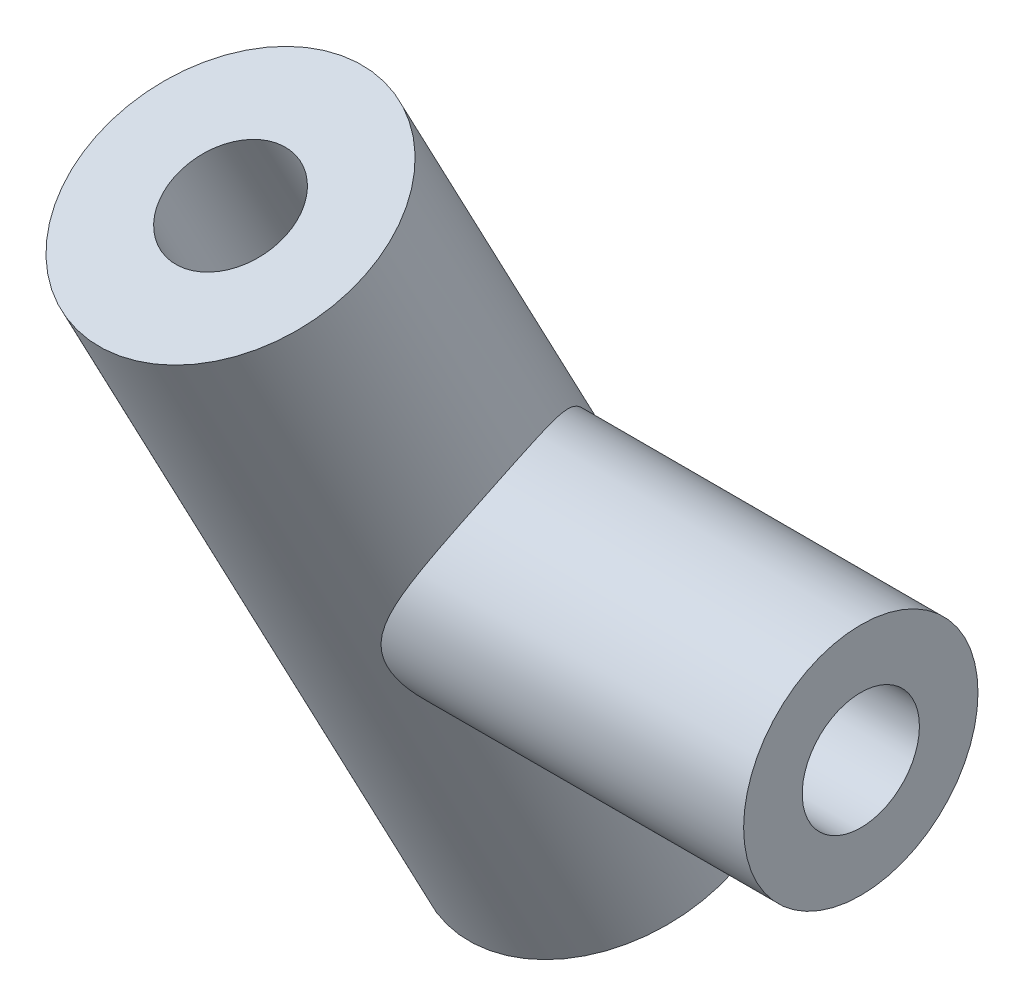
ISO-10303-21;
HEADER;
FILE_DESCRIPTION(('STEP AP214'),'2;1');
FILE_NAME('part.step','',(''),(''),'','','');
FILE_SCHEMA(('AUTOMOTIVE_DESIGN { 1 0 10303 214 1 1 1 1 }'));
ENDSEC;
DATA;
#1=APPLICATION_CONTEXT('core data for automotive mechanical design processes');
#2=APPLICATION_PROTOCOL_DEFINITION('international standard','automotive_design',2000,#1);
#3=PRODUCT_CONTEXT('',#1,'mechanical');
#4=PRODUCT('Part','Part','',(#3));
#5=PRODUCT_RELATED_PRODUCT_CATEGORY('part','',(#4));
#6=PRODUCT_DEFINITION_FORMATION('','',#4);
#7=PRODUCT_DEFINITION_CONTEXT('part definition',#1,'design');
#8=PRODUCT_DEFINITION('design','',#6,#7);
#9=PRODUCT_DEFINITION_SHAPE('','',#8);
#10=(LENGTH_UNIT() NAMED_UNIT(*) SI_UNIT(.MILLI.,.METRE.));
#11=(NAMED_UNIT(*) PLANE_ANGLE_UNIT() SI_UNIT($,.RADIAN.));
#12=(NAMED_UNIT(*) SI_UNIT($,.STERADIAN.) SOLID_ANGLE_UNIT());
#13=UNCERTAINTY_MEASURE_WITH_UNIT(LENGTH_MEASURE(1.E-05),#10,'distance_accuracy_value','');
#14=(GEOMETRIC_REPRESENTATION_CONTEXT(3) GLOBAL_UNCERTAINTY_ASSIGNED_CONTEXT((#13)) GLOBAL_UNIT_ASSIGNED_CONTEXT((#10,
#11,#12)) REPRESENTATION_CONTEXT('',''));
#15=CARTESIAN_POINT('',(0.,0.,0.));
#16=DIRECTION('',(0.,0.,1.));
#17=DIRECTION('',(1.,0.,0.));
#18=AXIS2_PLACEMENT_3D('',#15,#16,#17);
#19=CARTESIAN_POINT('',(-100.944609816095,-0.735404782747092,217.189048397354));
#20=DIRECTION('',(-0.0971690718763289,0.898098817347648,0.428925035116219));
#21=DIRECTION('',(0.,-0.430964406395254,0.902368927002912));
#22=AXIS2_PLACEMENT_3D('',#19,#20,#21);
#23=CYLINDRICAL_SURFACE('',#22,3.);
#24=CARTESIAN_POINT('',(-99.5812085126644,6.00033634736025,217.905986160726));
#25=CARTESIAN_POINT('',(-99.6358375281528,6.09418310201162,217.905983868715));
#26=CARTESIAN_POINT('',(-99.6887410224463,6.18906579974896,217.911241652532));
#27=CARTESIAN_POINT('',(-99.7875498783273,6.38128859248706,217.933290405989));
#28=CARTESIAN_POINT('',(-99.8334560772952,6.47862839181384,217.950079994269));
#29=CARTESIAN_POINT('',(-99.9052090204889,6.65615282242943,217.992170077222));
#30=CARTESIAN_POINT('',(-99.9332221193694,6.73597803000621,218.015170108359));
#31=CARTESIAN_POINT('',(-99.9778870414188,6.89558017650575,218.070258800592));
#32=CARTESIAN_POINT('',(-99.9945697336438,6.97535665014179,218.102322427708));
#33=CARTESIAN_POINT('',(-100.014304926961,7.13309337415013,218.175636790447));
#34=CARTESIAN_POINT('',(-100.017262014468,7.21103717411811,218.216949750747));
#35=CARTESIAN_POINT('',(-100.009558462211,7.361663393874,218.307287420402));
#36=CARTESIAN_POINT('',(-99.9988740600705,7.43433639909525,218.356325455651));
#37=CARTESIAN_POINT('',(-99.9626132574127,7.59004164944874,218.473475073043));
#38=CARTESIAN_POINT('',(-99.9339536276118,7.67104458261319,218.543273718603));
#39=CARTESIAN_POINT('',(-99.8661726388723,7.82147784408105,218.690013673523));
#40=CARTESIAN_POINT('',(-99.8270188451759,7.8908711914194,218.766976636254));
#41=CARTESIAN_POINT('',(-99.7539749952615,8.00217111771542,218.906501520867));
#42=CARTESIAN_POINT('',(-99.7212850144946,8.04657647746086,218.967737353941));
#43=CARTESIAN_POINT('',(-99.6543394643016,8.12935101364777,219.093371941709));
#44=CARTESIAN_POINT('',(-99.6200832336247,8.16771760965867,219.157772033186));
#45=CARTESIAN_POINT('',(-99.5167509290728,8.27388056256812,219.355545091418));
#46=CARTESIAN_POINT('',(-99.4470946378688,8.33276339936352,219.493520325928));
#47=CARTESIAN_POINT('',(-99.31255755687,8.42614898738385,219.782497102211));
#48=CARTESIAN_POINT('',(-99.2477588271593,8.46029288742648,219.933656069055));
#49=CARTESIAN_POINT('',(-99.1598809912347,8.49005419627694,220.166377321594));
#50=CARTESIAN_POINT('',(-99.1321554771363,8.49640146495031,220.244899741591));
#51=CARTESIAN_POINT('',(-99.0805274041756,8.50159214262861,220.403415334471));
#52=CARTESIAN_POINT('',(-99.0566230859868,8.50043901516484,220.483407811497));
#53=CARTESIAN_POINT('',(-99.0041853247533,8.48810241472412,220.678304347061));
#54=CARTESIAN_POINT('',(-98.9779874826611,8.47287284334662,220.793628237008));
#55=CARTESIAN_POINT('',(-98.9367374121586,8.42585787156793,221.022847765894));
#56=CARTESIAN_POINT('',(-98.9216773821301,8.39408408640084,221.136744349528));
#57=CARTESIAN_POINT('',(-98.9038584848897,8.31415981190723,221.360093969558));
#58=CARTESIAN_POINT('',(-98.9011375979613,8.26595924924303,221.469532260182));
#59=CARTESIAN_POINT('',(-98.9083425289514,8.15461082282735,221.680068597712));
#60=CARTESIAN_POINT('',(-98.9182694831899,8.09146161645993,221.78116589437));
#61=CARTESIAN_POINT('',(-98.9491956072808,7.95574043881967,221.967748369698));
#62=CARTESIAN_POINT('',(-98.9696654329895,7.88373428922158,222.053737265474));
#63=CARTESIAN_POINT('',(-99.0199167323507,7.73053402073686,222.213944351425));
#64=CARTESIAN_POINT('',(-99.0497001323857,7.64933800327346,222.288160101698));
#65=CARTESIAN_POINT('',(-99.1197681738103,7.4724151006179,222.430082951299));
#66=CARTESIAN_POINT('',(-99.1607499880667,7.37603815160272,222.496628678505));
#67=CARTESIAN_POINT('',(-99.2491398462882,7.17722879849564,222.614676450823));
#68=CARTESIAN_POINT('',(-99.2965521664576,7.07479239071902,222.666168412858));
#69=CARTESIAN_POINT('',(-99.4044411697424,6.84592744457425,222.762499063249));
#70=CARTESIAN_POINT('',(-99.4657036379001,6.71859229570576,222.804296916453));
#71=CARTESIAN_POINT('',(-99.5889392387316,6.45910261107355,222.867162904502));
#72=CARTESIAN_POINT('',(-99.6509128985142,6.32694431797604,222.888214503974));
#73=CARTESIAN_POINT('',(-99.757042494874,6.08582946764144,222.906821841649));
#74=CARTESIAN_POINT('',(-99.8022543001562,5.97763904284438,222.9082943547));
#75=CARTESIAN_POINT('',(-99.8841282442229,5.75881028231012,222.896691705963));
#76=CARTESIAN_POINT('',(-99.9208088922969,5.64817782721568,222.88364840063));
#77=CARTESIAN_POINT('',(-99.9706457770143,5.45648635206849,222.847486099006));
#78=CARTESIAN_POINT('',(-99.9875022436752,5.37570884894059,222.828150479259));
#79=CARTESIAN_POINT('',(-100.010048387469,5.21515367864688,222.780949673389));
#80=CARTESIAN_POINT('',(-100.015763241594,5.13537416293513,222.753103883159));
#81=CARTESIAN_POINT('',(-100.014227740402,4.97876585289557,222.689310593607));
#82=CARTESIAN_POINT('',(-100.006915139609,4.90195302613123,222.653324919374));
#83=CARTESIAN_POINT('',(-99.9798571669491,4.7540373947012,222.574806946914));
#84=CARTESIAN_POINT('',(-99.9600915551041,4.68294409856937,222.532264076413));
#85=CARTESIAN_POINT('',(-99.9022214550268,4.52422472216647,222.426652080259));
#86=CARTESIAN_POINT('',(-99.8601322114635,4.43943002104718,222.361585079496));
#87=CARTESIAN_POINT('',(-99.7652374574098,4.28193115030187,222.224790030539));
#88=CARTESIAN_POINT('',(-99.7123922976542,4.20927358007454,222.153037885692));
#89=CARTESIAN_POINT('',(-99.6119421956084,4.08798144561841,222.018262203418));
#90=CARTESIAN_POINT('',(-99.5652955135344,4.03741717999607,221.956228233067));
#91=CARTESIAN_POINT('',(-99.4701977974122,3.94296711154551,221.828500581516));
#92=CARTESIAN_POINT('',(-99.4217457033692,3.89908531155352,221.762804738764));
#93=CARTESIAN_POINT('',(-99.3244700126198,3.81780917581303,221.627780440484));
#94=CARTESIAN_POINT('',(-99.2756464275841,3.78041463713084,221.558452098676));
#95=CARTESIAN_POINT('',(-99.178803338431,3.71216304870487,221.416175857377));
#96=CARTESIAN_POINT('',(-99.1307835271578,3.68130344661241,221.343229384809));
#97=CARTESIAN_POINT('',(-99.0061145912866,3.60856482615956,221.14534205142));
#98=CARTESIAN_POINT('',(-98.9309930658302,3.57243052935322,221.01723267199));
#99=CARTESIAN_POINT('',(-98.7905428784071,3.5207212335681,220.75194318625));
#100=CARTESIAN_POINT('',(-98.7251932176643,3.50510157122131,220.61478347042));
#101=CARTESIAN_POINT('',(-98.6228605013754,3.49831955255221,220.366130897612));
#102=CARTESIAN_POINT('',(-98.5828128330661,3.50233223159129,220.256047280486));
#103=CARTESIAN_POINT('',(-98.514156500769,3.52566755771436,220.033886526226));
#104=CARTESIAN_POINT('',(-98.4855406175664,3.54498051954975,219.921810694046));
#105=CARTESIAN_POINT('',(-98.4419507218203,3.5998956168644,219.698003826455));
#106=CARTESIAN_POINT('',(-98.4270771762241,3.63561490120773,219.586281190113));
#107=CARTESIAN_POINT('',(-98.4128437331773,3.7229024148003,219.368167655418));
#108=CARTESIAN_POINT('',(-98.4134761797217,3.77446281016345,219.261774151833));
#109=CARTESIAN_POINT('',(-98.4291943875999,3.8847491189354,219.069897940698));
#110=CARTESIAN_POINT('',(-98.4426268794601,3.94199148875194,218.983413493338));
#111=CARTESIAN_POINT('',(-98.4805095535855,4.06532608548259,218.819719370233));
#112=CARTESIAN_POINT('',(-98.5049608482901,4.13141920547965,218.742510631944));
#113=CARTESIAN_POINT('',(-98.5644968682165,4.27332287950301,218.595371539609));
#114=CARTESIAN_POINT('',(-98.5999936036356,4.34942906903659,218.525896887516));
#115=CARTESIAN_POINT('',(-98.6791041240287,4.506898800845,218.398518918543));
#116=CARTESIAN_POINT('',(-98.7227254641869,4.58826719016179,218.34062647691));
#117=CARTESIAN_POINT('',(-98.8417548660491,4.80039989266701,218.207504857943));
#118=CARTESIAN_POINT('',(-98.921471393879,4.93377063265893,218.140192092118));
#119=CARTESIAN_POINT('',(-99.046907992314,5.13752914525335,218.058447506924));
#120=CARTESIAN_POINT('',(-99.0897401648042,5.20613191527736,218.034389868336));
#121=CARTESIAN_POINT('',(-99.1766193157414,5.3444529029061,217.992475855058));
#122=CARTESIAN_POINT('',(-99.2206658837689,5.41417074039539,217.974617412347));
#123=CARTESIAN_POINT('',(-99.3181500986896,5.56887895955878,217.9419837721));
#124=CARTESIAN_POINT('',(-99.3716801105502,5.65409833969181,217.928569073688));
#125=CARTESIAN_POINT('',(-99.477710370078,5.8260237104969,217.910574371606));
#126=CARTESIAN_POINT('',(-99.5302113004135,5.91272863883334,217.905988300361));
#127=CARTESIAN_POINT('',(-99.5812085126644,6.00033634736025,217.905986160726));
#128=B_SPLINE_CURVE_WITH_KNOTS('',3,(#24,#25,#26,#27,#28,#29,#30,#31,#32,#33,#34,#35,#36,#37,
#38,#39,#40,#41,#42,#43,#44,#45,#46,#47,#48,#49,#50,#51,#52,#53,#54,#55,#56,#57,#58,#59,#60,#61,
#62,#63,#64,#65,#66,#67,#68,#69,#70,#71,#72,#73,#74,#75,#76,#77,#78,#79,#80,#81,#82,#83,#84,#85,
#86,#87,#88,#89,#90,#91,#92,#93,#94,#95,#96,#97,#98,#99,#100,#101,#102,#103,#104,#105,#106,#107,
#108,#109,#110,#111,#112,#113,#114,#115,#116,#117,#118,#119,#120,#121,#122,#123,#124,#125,#126,
#127),.UNSPECIFIED.,.T.,.F.,(4,2,2,2,2,2,2,2,2,2,2,2,2,2,2,2,2,2,2,2,2,2,2,2,2,2,2,2,2,2,2,2,2,
2,2,2,2,2,2,2,2,2,2,2,2,2,2,2,2,2,2,4),(0.,0.32562674155716,0.651214484056793,0.91326046114609,
1.17458961363457,1.43773270263991,1.7013347916965,2.03161297028874,2.36292396627391,
2.60983288139663,2.85684701865921,3.35075349559856,3.85168824669664,4.10185829233875,
4.35191282271583,4.70800529494349,5.06384810093469,5.42078546251059,5.7777548946711,
6.11833301832542,6.45898163244852,6.82984834568645,7.20096290091591,7.64141929482344,
8.08222646217009,8.43311776408719,8.78324051489302,9.0365491011802,9.2892846129161,
9.54323094128887,9.79759107920998,10.1402760449025,10.4842478961828,10.7618061193736,
11.039529953073,11.3172450974828,11.5948515738785,12.0516479894852,12.5074482346191,
12.8577256651222,13.2077815431262,13.5603768020495,13.9127979723561,14.2251065688199,
14.537446702491,14.8632168441989,15.1892914504969,15.6942782742692,15.9472474686419,
16.2001321924578,16.5043200043978,16.8082986850552),.UNSPECIFIED.);
#129=CARTESIAN_POINT('',(-99.5812085126644,6.00033634736025,217.905986160726));
#130=VERTEX_POINT('',#129);
#131=EDGE_CURVE('E77',#130,#130,#128,.T.);
#132=ORIENTED_EDGE('',*,*,#131,.F.);
#133=EDGE_LOOP('',(#132));
#134=FACE_BOUND('',#133,.T.);
#135=CARTESIAN_POINT('',(-100.944609816095,-0.735404782747092,217.189048397354));
#136=DIRECTION('',(-0.0971690718763289,0.898098817347648,0.428925035116219));
#137=DIRECTION('',(0.,-0.430964406395254,0.902368927002912));
#138=AXIS2_PLACEMENT_3D('',#135,#136,#137);
#139=CIRCLE('',#138,3.);
#140=CARTESIAN_POINT('',(-100.944609816095,-2.02829800193286,219.896155178363));
#141=VERTEX_POINT('',#140);
#142=EDGE_CURVE('E74',#141,#141,#139,.T.);
#143=ORIENTED_EDGE('',*,*,#142,.T.);
#144=EDGE_LOOP('',(#143));
#145=FACE_BOUND('',#144,.T.);
#146=CARTESIAN_POINT('',(-102.40214589424,12.7360774774676,223.622923924097));
#147=DIRECTION('',(-0.0971690718763289,0.898098817347648,0.428925035116219));
#148=DIRECTION('',(0.,-0.430964406395254,0.902368927002912));
#149=AXIS2_PLACEMENT_3D('',#146,#147,#148);
#150=CIRCLE('',#149,3.);
#151=CARTESIAN_POINT('',(-102.40214589424,11.4431842582819,226.330030705106));
#152=VERTEX_POINT('',#151);
#153=EDGE_CURVE('E67',#152,#152,#150,.T.);
#154=ORIENTED_EDGE('',*,*,#153,.F.);
#155=EDGE_LOOP('',(#154));
#156=FACE_BOUND('',#155,.T.);
#157=ADVANCED_FACE('F35',(#134,#145,#156),#23,.T.);
#158=CARTESIAN_POINT('',(-100.944609816095,-0.735404782747092,217.189048397354));
#159=DIRECTION('',(-0.0971690718763289,0.898098817347648,0.428925035116219));
#160=DIRECTION('',(0.,-0.430964406395254,0.902368927002912));
#161=AXIS2_PLACEMENT_3D('',#158,#159,#160);
#162=PLANE('',#161);
#163=CARTESIAN_POINT('',(-100.944609816095,-0.735404782747095,217.189048397354));
#164=DIRECTION('',(0.097169071876329,-0.898098817347648,-0.428925035116219));
#165=DIRECTION('',(0.,0.430964406395254,-0.902368927002912));
#166=AXIS2_PLACEMENT_3D('',#163,#164,#165);
#167=CIRCLE('',#166,1.25000000000001);
#168=CARTESIAN_POINT('',(-100.944609816095,-0.196699274753024,216.0610872386));
#169=VERTEX_POINT('',#168);
#170=EDGE_CURVE('E63',#169,#169,#167,.T.);
#171=ORIENTED_EDGE('',*,*,#170,.F.);
#172=EDGE_LOOP('',(#171));
#173=FACE_BOUND('',#172,.T.);
#174=ORIENTED_EDGE('',*,*,#142,.F.);
#175=EDGE_LOOP('',(#174));
#176=FACE_BOUND('',#175,.T.);
#177=ADVANCED_FACE('F92',(#173,#176),#162,.F.);
#178=CARTESIAN_POINT('',(-102.40214589424,12.7360774774676,223.622923924097));
#179=DIRECTION('',(-0.0971690718763289,0.898098817347648,0.428925035116219));
#180=DIRECTION('',(0.,-0.430964406395254,0.902368927002912));
#181=AXIS2_PLACEMENT_3D('',#178,#179,#180);
#182=PLANE('',#181);
#183=CARTESIAN_POINT('',(-102.40214589424,12.7360774774676,223.622923924097));
#184=DIRECTION('',(-0.0971690718763289,0.898098817347648,0.428925035116219));
#185=DIRECTION('',(0.,-0.430964406395254,0.902368927002912));
#186=AXIS2_PLACEMENT_3D('',#183,#184,#185);
#187=CIRCLE('',#186,1.25000000000001);
#188=CARTESIAN_POINT('',(-102.40214589424,12.1973719694736,224.750885082851));
#189=VERTEX_POINT('',#188);
#190=EDGE_CURVE('E60',#189,#189,#187,.T.);
#191=ORIENTED_EDGE('',*,*,#190,.F.);
#192=EDGE_LOOP('',(#191));
#193=FACE_BOUND('',#192,.T.);
#194=ORIENTED_EDGE('',*,*,#153,.T.);
#195=EDGE_LOOP('',(#194));
#196=FACE_BOUND('',#195,.T.);
#197=ADVANCED_FACE('F89',(#193,#196),#182,.T.);
#198=CARTESIAN_POINT('',(-100.673377855167,6.00033634736025,220.405986160726));
#199=DIRECTION('',(1.,0.,0.));
#200=DIRECTION('',(0.,0.,-1.));
#201=AXIS2_PLACEMENT_3D('',#198,#199,#200);
#202=CYLINDRICAL_SURFACE('',#201,2.5);
#203=CARTESIAN_POINT('',(-92.1733778551674,6.00033634736027,220.405986160726));
#204=DIRECTION('',(-1.,0.,0.));
#205=DIRECTION('',(0.,0.,1.));
#206=AXIS2_PLACEMENT_3D('',#203,#204,#205);
#207=CIRCLE('',#206,2.5);
#208=CARTESIAN_POINT('',(-92.1733778551674,6.00033634736027,222.905986160726));
#209=VERTEX_POINT('',#208);
#210=EDGE_CURVE('E51',#209,#209,#207,.F.);
#211=ORIENTED_EDGE('',*,*,#210,.F.);
#212=EDGE_LOOP('',(#211));
#213=FACE_BOUND('',#212,.T.);
#214=ORIENTED_EDGE('',*,*,#131,.T.);
#215=EDGE_LOOP('',(#214));
#216=FACE_BOUND('',#215,.T.);
#217=ADVANCED_FACE('F84',(#213,#216),#202,.T.);
#218=CARTESIAN_POINT('',(-92.1733778551674,3.40790909292094,231.635047605497));
#219=DIRECTION('',(-1.,0.,0.));
#220=DIRECTION('',(0.,0.,1.));
#221=AXIS2_PLACEMENT_3D('',#218,#219,#220);
#222=PLANE('',#221);
#223=CARTESIAN_POINT('',(-92.1733778551674,6.00033634736027,220.405986160726));
#224=DIRECTION('',(1.,0.,0.));
#225=DIRECTION('',(0.,0.,-1.));
#226=AXIS2_PLACEMENT_3D('',#223,#224,#225);
#227=CIRCLE('',#226,1.25);
#228=CARTESIAN_POINT('',(-92.1733778551674,6.00033634736027,219.155986160726));
#229=VERTEX_POINT('',#228);
#230=EDGE_CURVE('E65',#229,#229,#227,.T.);
#231=ORIENTED_EDGE('',*,*,#230,.F.);
#232=EDGE_LOOP('',(#231));
#233=FACE_BOUND('',#232,.T.);
#234=ORIENTED_EDGE('',*,*,#210,.T.);
#235=EDGE_LOOP('',(#234));
#236=FACE_BOUND('',#235,.T.);
#237=ADVANCED_FACE('F55',(#233,#236),#222,.F.);
#238=CARTESIAN_POINT('',(-103.130913933312,19.471818607575,226.839861687469));
#239=DIRECTION('',(0.097169071876329,-0.898098817347648,-0.428925035116219));
#240=DIRECTION('',(0.,0.430964406395254,-0.902368927002912));
#241=AXIS2_PLACEMENT_3D('',#238,#239,#240);
#242=CYLINDRICAL_SURFACE('',#241,1.25000000000001);
#243=CARTESIAN_POINT('',(-101.673377855167,6.00033634736026,220.405986160726));
#244=DIRECTION('',(-0.671874589534264,-0.668353016572782,-0.319200221140629));
#245=DIRECTION('',(0.740664928249046,-0.606278752438553,-0.289554033650693));
#246=AXIS2_PLACEMENT_3D('',#243,#244,#245);
#247=ELLIPSE('',#246,1.86046625288581,1.25);
#248=CARTESIAN_POINT('',(-101.673377855167,5.46163083936619,221.533947319479));
#249=VERTEX_POINT('',#248);
#250=CARTESIAN_POINT('',(-101.673377855167,6.53904185535434,219.278025001972));
#251=VERTEX_POINT('',#250);
#252=EDGE_CURVE('E43',#249,#251,#247,.F.);
#253=ORIENTED_EDGE('',*,*,#252,.T.);
#254=CARTESIAN_POINT('',(-101.673377855167,6.00033634736026,220.405986160726));
#255=DIRECTION('',(0.740664928249046,-0.606278752438553,-0.289554033650693));
#256=DIRECTION('',(-0.671874589534264,-0.668353016572782,-0.319200221140629));
#257=AXIS2_PLACEMENT_3D('',#254,#255,#256);
#258=ELLIPSE('',#257,1.68767272801082,1.25);
#259=EDGE_CURVE('E11',#251,#249,#258,.T.);
#260=ORIENTED_EDGE('',*,*,#259,.T.);
#261=EDGE_LOOP('',(#253,#260));
#262=FACE_BOUND('',#261,.T.);
#263=ORIENTED_EDGE('',*,*,#190,.T.);
#264=EDGE_LOOP('',(#263));
#265=FACE_BOUND('',#264,.T.);
#266=ORIENTED_EDGE('',*,*,#170,.T.);
#267=EDGE_LOOP('',(#266));
#268=FACE_BOUND('',#267,.T.);
#269=ADVANCED_FACE('F52',(#262,#265,#268),#242,.F.);
#270=CARTESIAN_POINT('',(-101.673377855167,6.00033634736024,220.405986160726));
#271=DIRECTION('',(1.,0.,0.));
#272=DIRECTION('',(0.,0.,-1.));
#273=AXIS2_PLACEMENT_3D('',#270,#271,#272);
#274=CYLINDRICAL_SURFACE('',#273,1.25);
#275=ORIENTED_EDGE('',*,*,#230,.T.);
#276=EDGE_LOOP('',(#275));
#277=FACE_BOUND('',#276,.T.);
#278=ORIENTED_EDGE('',*,*,#252,.F.);
#279=ORIENTED_EDGE('',*,*,#259,.F.);
#280=EDGE_LOOP('',(#278,#279));
#281=FACE_BOUND('',#280,.T.);
#282=ADVANCED_FACE('F49',(#277,#281),#274,.F.);
#283=CLOSED_SHELL('',(#157,#177,#197,#217,#237,#269,#282));
#284=MANIFOLD_SOLID_BREP('B2',#283);
#285=ADVANCED_BREP_SHAPE_REPRESENTATION('',(#18,#284),#14);
#286=SHAPE_DEFINITION_REPRESENTATION(#9,#285);
ENDSEC;
END-ISO-10303-21;
